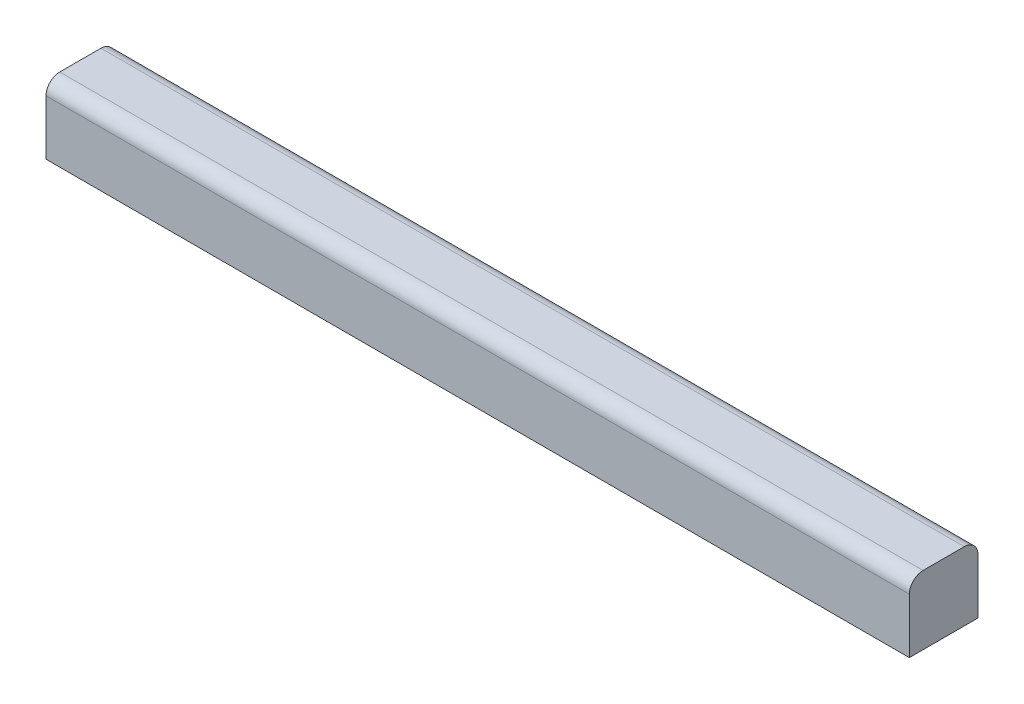
ISO-10303-21;
HEADER;
FILE_DESCRIPTION(('STEP AP214'),'2;1');
FILE_NAME('part.step','',(''),(''),'','','');
FILE_SCHEMA(('AUTOMOTIVE_DESIGN { 1 0 10303 214 1 1 1 1 }'));
ENDSEC;
DATA;
#1=APPLICATION_CONTEXT('core data for automotive mechanical design processes');
#2=APPLICATION_PROTOCOL_DEFINITION('international standard','automotive_design',2000,#1);
#3=PRODUCT_CONTEXT('',#1,'mechanical');
#4=PRODUCT('Part','Part','',(#3));
#5=PRODUCT_RELATED_PRODUCT_CATEGORY('part','',(#4));
#6=PRODUCT_DEFINITION_FORMATION('','',#4);
#7=PRODUCT_DEFINITION_CONTEXT('part definition',#1,'design');
#8=PRODUCT_DEFINITION('design','',#6,#7);
#9=PRODUCT_DEFINITION_SHAPE('','',#8);
#10=(LENGTH_UNIT() NAMED_UNIT(*) SI_UNIT(.MILLI.,.METRE.));
#11=(NAMED_UNIT(*) PLANE_ANGLE_UNIT() SI_UNIT($,.RADIAN.));
#12=(NAMED_UNIT(*) SI_UNIT($,.STERADIAN.) SOLID_ANGLE_UNIT());
#13=UNCERTAINTY_MEASURE_WITH_UNIT(LENGTH_MEASURE(1.E-05),#10,'distance_accuracy_value','');
#14=(GEOMETRIC_REPRESENTATION_CONTEXT(3) GLOBAL_UNCERTAINTY_ASSIGNED_CONTEXT((#13)) GLOBAL_UNIT_ASSIGNED_CONTEXT((#10,
#11,#12)) REPRESENTATION_CONTEXT('',''));
#15=CARTESIAN_POINT('',(0.,0.,0.));
#16=DIRECTION('',(0.,0.,1.));
#17=DIRECTION('',(1.,0.,0.));
#18=AXIS2_PLACEMENT_3D('',#15,#16,#17);
#19=CARTESIAN_POINT('',(-2.83913978494623,0.,1.5));
#20=DIRECTION('',(-1.,0.,0.));
#21=DIRECTION('',(0.,-1.,0.));
#22=AXIS2_PLACEMENT_3D('',#19,#20,#21);
#23=PLANE('',#22);
#24=DIRECTION('',(0.,1.,0.));
#25=VECTOR('',#24,1.);
#26=CARTESIAN_POINT('',(-2.83913978494623,0.,0.));
#27=LINE('',#26,#25);
#28=CARTESIAN_POINT('',(-2.83913978494623,0.,0.));
#29=VERTEX_POINT('',#28);
#30=CARTESIAN_POINT('',(-2.83913978494623,1.2,0.));
#31=VERTEX_POINT('',#30);
#32=EDGE_CURVE('E119',#29,#31,#27,.T.);
#33=ORIENTED_EDGE('',*,*,#32,.T.);
#34=CARTESIAN_POINT('',(-2.83913978494623,1.2,0.3));
#35=DIRECTION('',(-1.,0.,0.));
#36=DIRECTION('',(0.,-1.,0.));
#37=AXIS2_PLACEMENT_3D('',#34,#35,#36);
#38=CIRCLE('',#37,0.3);
#39=CARTESIAN_POINT('',(-2.83913978494623,1.5,0.3));
#40=VERTEX_POINT('',#39);
#41=EDGE_CURVE('E45',#31,#40,#38,.F.);
#42=ORIENTED_EDGE('',*,*,#41,.T.);
#43=DIRECTION('',(0.,0.,-1.));
#44=VECTOR('',#43,1.);
#45=CARTESIAN_POINT('',(-2.83913978494623,1.5,1.5));
#46=LINE('',#45,#44);
#47=CARTESIAN_POINT('',(-2.83913978494623,1.5,1.2));
#48=VERTEX_POINT('',#47);
#49=EDGE_CURVE('E125',#48,#40,#46,.T.);
#50=ORIENTED_EDGE('',*,*,#49,.F.);
#51=CARTESIAN_POINT('',(-2.83913978494623,1.2,1.2));
#52=DIRECTION('',(-1.,0.,0.));
#53=DIRECTION('',(0.,-1.,0.));
#54=AXIS2_PLACEMENT_3D('',#51,#52,#53);
#55=CIRCLE('',#54,0.3);
#56=CARTESIAN_POINT('',(-2.83913978494623,1.2,1.5));
#57=VERTEX_POINT('',#56);
#58=EDGE_CURVE('E52',#48,#57,#55,.F.);
#59=ORIENTED_EDGE('',*,*,#58,.T.);
#60=DIRECTION('',(0.,1.,0.));
#61=VECTOR('',#60,1.);
#62=CARTESIAN_POINT('',(-2.83913978494623,0.,1.5));
#63=LINE('',#62,#61);
#64=CARTESIAN_POINT('',(-2.83913978494623,0.,1.5));
#65=VERTEX_POINT('',#64);
#66=EDGE_CURVE('E101',#65,#57,#63,.T.);
#67=ORIENTED_EDGE('',*,*,#66,.F.);
#68=DIRECTION('',(0.,0.,-1.));
#69=VECTOR('',#68,1.);
#70=CARTESIAN_POINT('',(-2.83913978494623,0.,1.5));
#71=LINE('',#70,#69);
#72=EDGE_CURVE('E111',#65,#29,#71,.T.);
#73=ORIENTED_EDGE('',*,*,#72,.T.);
#74=EDGE_LOOP('',(#33,#42,#50,#59,#67,#73));
#75=FACE_BOUND('',#74,.T.);
#76=ADVANCED_FACE('F37',(#75),#23,.F.);
#77=CARTESIAN_POINT('',(-2.83913978494623,1.5,1.5));
#78=DIRECTION('',(0.,-1.,0.));
#79=DIRECTION('',(1.,0.,0.));
#80=AXIS2_PLACEMENT_3D('',#77,#78,#79);
#81=PLANE('',#80);
#82=ORIENTED_EDGE('',*,*,#49,.T.);
#83=DIRECTION('',(-1.,0.,0.));
#84=VECTOR('',#83,1.);
#85=CARTESIAN_POINT('',(-2.83913978494623,1.5,0.3));
#86=LINE('',#85,#84);
#87=CARTESIAN_POINT('',(-21.6991397849462,1.5,0.3));
#88=VERTEX_POINT('',#87);
#89=EDGE_CURVE('E130',#40,#88,#86,.T.);
#90=ORIENTED_EDGE('',*,*,#89,.T.);
#91=DIRECTION('',(0.,0.,-1.));
#92=VECTOR('',#91,1.);
#93=CARTESIAN_POINT('',(-21.6991397849462,1.5,1.5));
#94=LINE('',#93,#92);
#95=CARTESIAN_POINT('',(-21.6991397849462,1.5,1.2));
#96=VERTEX_POINT('',#95);
#97=EDGE_CURVE('E110',#96,#88,#94,.T.);
#98=ORIENTED_EDGE('',*,*,#97,.F.);
#99=DIRECTION('',(-1.,0.,0.));
#100=VECTOR('',#99,1.);
#101=CARTESIAN_POINT('',(-2.83913978494623,1.5,1.2));
#102=LINE('',#101,#100);
#103=EDGE_CURVE('E128',#96,#48,#102,.F.);
#104=ORIENTED_EDGE('',*,*,#103,.T.);
#105=EDGE_LOOP('',(#82,#90,#98,#104));
#106=FACE_BOUND('',#105,.T.);
#107=ADVANCED_FACE('F142',(#106),#81,.F.);
#108=CARTESIAN_POINT('',(-21.6991397849462,1.5,1.5));
#109=DIRECTION('',(1.,0.,0.));
#110=DIRECTION('',(0.,0.,-1.));
#111=AXIS2_PLACEMENT_3D('',#108,#109,#110);
#112=PLANE('',#111);
#113=ORIENTED_EDGE('',*,*,#97,.T.);
#114=CARTESIAN_POINT('',(-21.6991397849462,1.2,0.3));
#115=DIRECTION('',(1.,0.,0.));
#116=DIRECTION('',(0.,0.,-1.));
#117=AXIS2_PLACEMENT_3D('',#114,#115,#116);
#118=CIRCLE('',#117,0.3);
#119=CARTESIAN_POINT('',(-21.6991397849462,1.2,0.));
#120=VERTEX_POINT('',#119);
#121=EDGE_CURVE('E135',#88,#120,#118,.F.);
#122=ORIENTED_EDGE('',*,*,#121,.T.);
#123=DIRECTION('',(0.,-1.,0.));
#124=VECTOR('',#123,1.);
#125=CARTESIAN_POINT('',(-21.6991397849462,1.5,0.));
#126=LINE('',#125,#124);
#127=CARTESIAN_POINT('',(-21.6991397849462,0.,0.));
#128=VERTEX_POINT('',#127);
#129=EDGE_CURVE('E107',#120,#128,#126,.T.);
#130=ORIENTED_EDGE('',*,*,#129,.T.);
#131=DIRECTION('',(0.,0.,-1.));
#132=VECTOR('',#131,1.);
#133=CARTESIAN_POINT('',(-21.6991397849462,0.,1.5));
#134=LINE('',#133,#132);
#135=CARTESIAN_POINT('',(-21.6991397849462,0.,1.5));
#136=VERTEX_POINT('',#135);
#137=EDGE_CURVE('E104',#136,#128,#134,.T.);
#138=ORIENTED_EDGE('',*,*,#137,.F.);
#139=DIRECTION('',(0.,-1.,0.));
#140=VECTOR('',#139,1.);
#141=CARTESIAN_POINT('',(-21.6991397849462,1.5,1.5));
#142=LINE('',#141,#140);
#143=CARTESIAN_POINT('',(-21.6991397849462,1.2,1.5));
#144=VERTEX_POINT('',#143);
#145=EDGE_CURVE('E93',#144,#136,#142,.T.);
#146=ORIENTED_EDGE('',*,*,#145,.F.);
#147=CARTESIAN_POINT('',(-21.6991397849462,1.2,1.2));
#148=DIRECTION('',(1.,0.,0.));
#149=DIRECTION('',(0.,0.,-1.));
#150=AXIS2_PLACEMENT_3D('',#147,#148,#149);
#151=CIRCLE('',#150,0.3);
#152=EDGE_CURVE('E133',#144,#96,#151,.F.);
#153=ORIENTED_EDGE('',*,*,#152,.T.);
#154=EDGE_LOOP('',(#113,#122,#130,#138,#146,#153));
#155=FACE_BOUND('',#154,.T.);
#156=ADVANCED_FACE('F106',(#155),#112,.F.);
#157=CARTESIAN_POINT('',(-2.83913978494623,0.,1.5));
#158=DIRECTION('',(0.,1.,0.));
#159=DIRECTION('',(0.,0.,1.));
#160=AXIS2_PLACEMENT_3D('',#157,#158,#159);
#161=PLANE('',#160);
#162=DIRECTION('',(1.,0.,0.));
#163=VECTOR('',#162,1.);
#164=CARTESIAN_POINT('',(-2.83913978494623,0.,0.));
#165=LINE('',#164,#163);
#166=EDGE_CURVE('E122',#128,#29,#165,.T.);
#167=ORIENTED_EDGE('',*,*,#166,.T.);
#168=ORIENTED_EDGE('',*,*,#72,.F.);
#169=DIRECTION('',(1.,0.,0.));
#170=VECTOR('',#169,1.);
#171=CARTESIAN_POINT('',(-2.83913978494623,0.,1.5));
#172=LINE('',#171,#170);
#173=EDGE_CURVE('E97',#136,#65,#172,.T.);
#174=ORIENTED_EDGE('',*,*,#173,.F.);
#175=ORIENTED_EDGE('',*,*,#137,.T.);
#176=EDGE_LOOP('',(#167,#168,#174,#175));
#177=FACE_BOUND('',#176,.T.);
#178=ADVANCED_FACE('F113',(#177),#161,.F.);
#179=CARTESIAN_POINT('',(0.,0.,1.5));
#180=DIRECTION('',(0.,0.,1.));
#181=DIRECTION('',(1.,0.,0.));
#182=AXIS2_PLACEMENT_3D('',#179,#180,#181);
#183=PLANE('',#182);
#184=ORIENTED_EDGE('',*,*,#66,.T.);
#185=DIRECTION('',(-1.,0.,0.));
#186=VECTOR('',#185,1.);
#187=CARTESIAN_POINT('',(-21.6991397849462,1.2,1.5));
#188=LINE('',#187,#186);
#189=EDGE_CURVE('E11',#57,#144,#188,.T.);
#190=ORIENTED_EDGE('',*,*,#189,.T.);
#191=ORIENTED_EDGE('',*,*,#145,.T.);
#192=ORIENTED_EDGE('',*,*,#173,.T.);
#193=EDGE_LOOP('',(#184,#190,#191,#192));
#194=FACE_BOUND('',#193,.T.);
#195=ADVANCED_FACE('F95',(#194),#183,.T.);
#196=CARTESIAN_POINT('',(0.,0.,0.));
#197=DIRECTION('',(0.,0.,1.));
#198=DIRECTION('',(1.,0.,0.));
#199=AXIS2_PLACEMENT_3D('',#196,#197,#198);
#200=PLANE('',#199);
#201=ORIENTED_EDGE('',*,*,#129,.F.);
#202=DIRECTION('',(-1.,0.,0.));
#203=VECTOR('',#202,1.);
#204=CARTESIAN_POINT('',(0.,1.2,0.));
#205=LINE('',#204,#203);
#206=EDGE_CURVE('E60',#120,#31,#205,.F.);
#207=ORIENTED_EDGE('',*,*,#206,.T.);
#208=ORIENTED_EDGE('',*,*,#32,.F.);
#209=ORIENTED_EDGE('',*,*,#166,.F.);
#210=EDGE_LOOP('',(#201,#207,#208,#209));
#211=FACE_BOUND('',#210,.T.);
#212=ADVANCED_FACE('F146',(#211),#200,.F.);
#213=CARTESIAN_POINT('',(-2.83913978494623,1.2,0.3));
#214=DIRECTION('',(-1.,0.,0.));
#215=DIRECTION('',(0.,-1.,0.));
#216=AXIS2_PLACEMENT_3D('',#213,#214,#215);
#217=CYLINDRICAL_SURFACE('',#216,0.3);
#218=ORIENTED_EDGE('',*,*,#41,.F.);
#219=ORIENTED_EDGE('',*,*,#206,.F.);
#220=ORIENTED_EDGE('',*,*,#121,.F.);
#221=ORIENTED_EDGE('',*,*,#89,.F.);
#222=EDGE_LOOP('',(#218,#219,#220,#221));
#223=FACE_BOUND('',#222,.T.);
#224=ADVANCED_FACE('F145',(#223),#217,.T.);
#225=CARTESIAN_POINT('',(0.,1.2,1.2));
#226=DIRECTION('',(1.,0.,0.));
#227=DIRECTION('',(0.,1.,0.));
#228=AXIS2_PLACEMENT_3D('',#225,#226,#227);
#229=CYLINDRICAL_SURFACE('',#228,0.3);
#230=ORIENTED_EDGE('',*,*,#58,.F.);
#231=ORIENTED_EDGE('',*,*,#103,.F.);
#232=ORIENTED_EDGE('',*,*,#152,.F.);
#233=ORIENTED_EDGE('',*,*,#189,.F.);
#234=EDGE_LOOP('',(#230,#231,#232,#233));
#235=FACE_BOUND('',#234,.T.);
#236=ADVANCED_FACE('F39',(#235),#229,.T.);
#237=CLOSED_SHELL('',(#76,#107,#156,#178,#195,#212,#224,#236));
#238=MANIFOLD_SOLID_BREP('B2',#237);
#239=ADVANCED_BREP_SHAPE_REPRESENTATION('',(#18,#238),#14);
#240=SHAPE_DEFINITION_REPRESENTATION(#9,#239);
ENDSEC;
END-ISO-10303-21;
